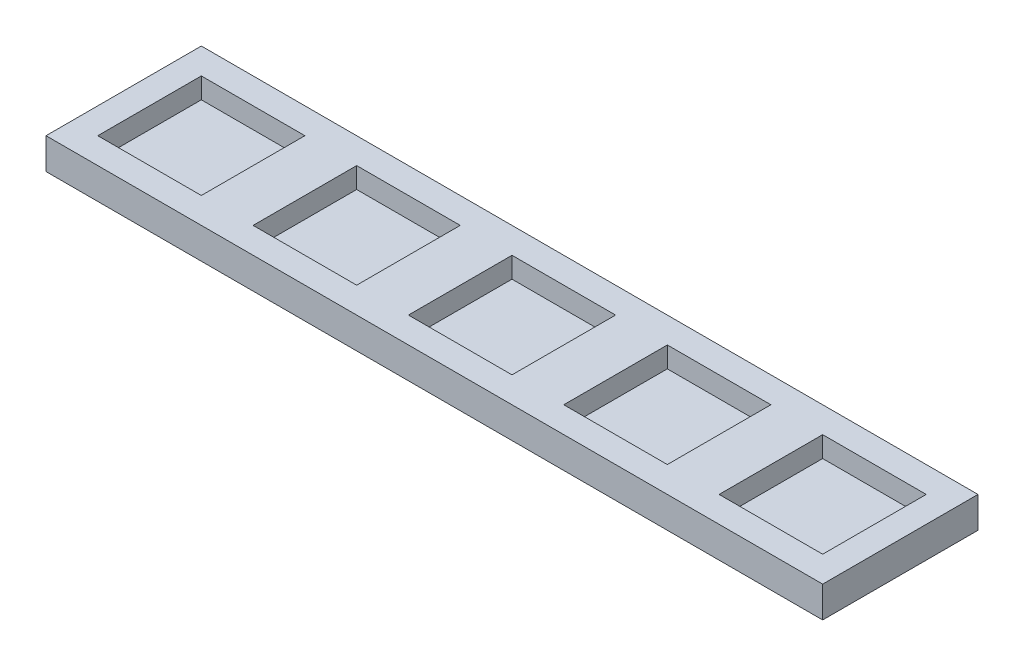
ISO-10303-21;
HEADER;
FILE_DESCRIPTION(('STEP AP214'),'2;1');
FILE_NAME('part.step','',(''),(''),'','','');
FILE_SCHEMA(('AUTOMOTIVE_DESIGN { 1 0 10303 214 1 1 1 1 }'));
ENDSEC;
DATA;
#1=APPLICATION_CONTEXT('core data for automotive mechanical design processes');
#2=APPLICATION_PROTOCOL_DEFINITION('international standard','automotive_design',2000,#1);
#3=PRODUCT_CONTEXT('',#1,'mechanical');
#4=PRODUCT('Part','Part','',(#3));
#5=PRODUCT_RELATED_PRODUCT_CATEGORY('part','',(#4));
#6=PRODUCT_DEFINITION_FORMATION('','',#4);
#7=PRODUCT_DEFINITION_CONTEXT('part definition',#1,'design');
#8=PRODUCT_DEFINITION('design','',#6,#7);
#9=PRODUCT_DEFINITION_SHAPE('','',#8);
#10=(LENGTH_UNIT() NAMED_UNIT(*) SI_UNIT(.MILLI.,.METRE.));
#11=(NAMED_UNIT(*) PLANE_ANGLE_UNIT() SI_UNIT($,.RADIAN.));
#12=(NAMED_UNIT(*) SI_UNIT($,.STERADIAN.) SOLID_ANGLE_UNIT());
#13=UNCERTAINTY_MEASURE_WITH_UNIT(LENGTH_MEASURE(1.E-05),#10,'distance_accuracy_value','');
#14=(GEOMETRIC_REPRESENTATION_CONTEXT(3) GLOBAL_UNCERTAINTY_ASSIGNED_CONTEXT((#13)) GLOBAL_UNIT_ASSIGNED_CONTEXT((#10,
#11,#12)) REPRESENTATION_CONTEXT('',''));
#15=CARTESIAN_POINT('',(0.,0.,0.));
#16=DIRECTION('',(0.,0.,1.));
#17=DIRECTION('',(1.,0.,0.));
#18=AXIS2_PLACEMENT_3D('',#15,#16,#17);
#19=CARTESIAN_POINT('',(-375.,30.,150.));
#20=DIRECTION('',(0.,0.,-1.));
#21=DIRECTION('',(-1.,0.,0.));
#22=AXIS2_PLACEMENT_3D('',#19,#20,#21);
#23=PLANE('',#22);
#24=DIRECTION('',(1.,0.,0.));
#25=VECTOR('',#24,1.);
#26=CARTESIAN_POINT('',(-375.,0.,150.));
#27=LINE('',#26,#25);
#28=CARTESIAN_POINT('',(-375.,0.,150.));
#29=VERTEX_POINT('',#28);
#30=CARTESIAN_POINT('',(375.,0.,150.));
#31=VERTEX_POINT('',#30);
#32=EDGE_CURVE('E232',#29,#31,#27,.T.);
#33=ORIENTED_EDGE('',*,*,#32,.T.);
#34=DIRECTION('',(0.,-1.,0.));
#35=VECTOR('',#34,1.);
#36=CARTESIAN_POINT('',(375.,30.,150.));
#37=LINE('',#36,#35);
#38=CARTESIAN_POINT('',(375.,30.,150.));
#39=VERTEX_POINT('',#38);
#40=EDGE_CURVE('E11',#39,#31,#37,.T.);
#41=ORIENTED_EDGE('',*,*,#40,.F.);
#42=DIRECTION('',(1.,0.,0.));
#43=VECTOR('',#42,1.);
#44=CARTESIAN_POINT('',(-375.,30.,150.));
#45=LINE('',#44,#43);
#46=CARTESIAN_POINT('',(-375.,30.,150.));
#47=VERTEX_POINT('',#46);
#48=EDGE_CURVE('E361',#47,#39,#45,.T.);
#49=ORIENTED_EDGE('',*,*,#48,.F.);
#50=DIRECTION('',(0.,-1.,0.));
#51=VECTOR('',#50,1.);
#52=CARTESIAN_POINT('',(-375.,30.,150.));
#53=LINE('',#52,#51);
#54=EDGE_CURVE('E371',#47,#29,#53,.T.);
#55=ORIENTED_EDGE('',*,*,#54,.T.);
#56=EDGE_LOOP('',(#33,#41,#49,#55));
#57=FACE_BOUND('',#56,.T.);
#58=ADVANCED_FACE('F36',(#57),#23,.F.);
#59=CARTESIAN_POINT('',(375.,30.,150.));
#60=DIRECTION('',(-1.,0.,0.));
#61=DIRECTION('',(0.,0.,1.));
#62=AXIS2_PLACEMENT_3D('',#59,#60,#61);
#63=PLANE('',#62);
#64=DIRECTION('',(0.,0.,-1.));
#65=VECTOR('',#64,1.);
#66=CARTESIAN_POINT('',(375.,0.,150.));
#67=LINE('',#66,#65);
#68=CARTESIAN_POINT('',(375.,0.,-1.22464679914735E-13));
#69=VERTEX_POINT('',#68);
#70=EDGE_CURVE('E374',#31,#69,#67,.T.);
#71=ORIENTED_EDGE('',*,*,#70,.T.);
#72=DIRECTION('',(0.,-1.,0.));
#73=VECTOR('',#72,1.);
#74=CARTESIAN_POINT('',(375.,30.,-1.22464679914735E-13));
#75=LINE('',#74,#73);
#76=CARTESIAN_POINT('',(375.,30.,-1.22464679914735E-13));
#77=VERTEX_POINT('',#76);
#78=EDGE_CURVE('E43',#77,#69,#75,.T.);
#79=ORIENTED_EDGE('',*,*,#78,.F.);
#80=DIRECTION('',(0.,0.,-1.));
#81=VECTOR('',#80,1.);
#82=CARTESIAN_POINT('',(375.,30.,150.));
#83=LINE('',#82,#81);
#84=EDGE_CURVE('E364',#39,#77,#83,.T.);
#85=ORIENTED_EDGE('',*,*,#84,.F.);
#86=ORIENTED_EDGE('',*,*,#40,.T.);
#87=EDGE_LOOP('',(#71,#79,#85,#86));
#88=FACE_BOUND('',#87,.T.);
#89=ADVANCED_FACE('F404',(#88),#63,.F.);
#90=CARTESIAN_POINT('',(375.,30.,-1.22464679914735E-13));
#91=DIRECTION('',(0.,0.,1.));
#92=DIRECTION('',(1.,0.,0.));
#93=AXIS2_PLACEMENT_3D('',#90,#91,#92);
#94=PLANE('',#93);
#95=DIRECTION('',(-1.,0.,0.));
#96=VECTOR('',#95,1.);
#97=CARTESIAN_POINT('',(375.,0.,-1.22464679914735E-13));
#98=LINE('',#97,#96);
#99=CARTESIAN_POINT('',(-375.,0.,1.07156594925393E-13));
#100=VERTEX_POINT('',#99);
#101=EDGE_CURVE('E376',#69,#100,#98,.T.);
#102=ORIENTED_EDGE('',*,*,#101,.T.);
#103=DIRECTION('',(0.,-1.,0.));
#104=VECTOR('',#103,1.);
#105=CARTESIAN_POINT('',(-375.,30.,1.07156594925393E-13));
#106=LINE('',#105,#104);
#107=CARTESIAN_POINT('',(-375.,30.,1.07156594925393E-13));
#108=VERTEX_POINT('',#107);
#109=EDGE_CURVE('E381',#108,#100,#106,.T.);
#110=ORIENTED_EDGE('',*,*,#109,.F.);
#111=DIRECTION('',(-1.,0.,0.));
#112=VECTOR('',#111,1.);
#113=CARTESIAN_POINT('',(375.,30.,-1.22464679914735E-13));
#114=LINE('',#113,#112);
#115=EDGE_CURVE('E367',#77,#108,#114,.T.);
#116=ORIENTED_EDGE('',*,*,#115,.F.);
#117=ORIENTED_EDGE('',*,*,#78,.T.);
#118=EDGE_LOOP('',(#102,#110,#116,#117));
#119=FACE_BOUND('',#118,.T.);
#120=ADVANCED_FACE('F388',(#119),#94,.F.);
#121=CARTESIAN_POINT('',(-375.,30.,1.07156594925393E-13));
#122=DIRECTION('',(1.,0.,0.));
#123=DIRECTION('',(0.,0.,-1.));
#124=AXIS2_PLACEMENT_3D('',#121,#122,#123);
#125=PLANE('',#124);
#126=DIRECTION('',(0.,0.,1.));
#127=VECTOR('',#126,1.);
#128=CARTESIAN_POINT('',(-375.,0.,1.07156594925393E-13));
#129=LINE('',#128,#127);
#130=EDGE_CURVE('E365',#100,#29,#129,.T.);
#131=ORIENTED_EDGE('',*,*,#130,.T.);
#132=ORIENTED_EDGE('',*,*,#54,.F.);
#133=DIRECTION('',(0.,0.,1.));
#134=VECTOR('',#133,1.);
#135=CARTESIAN_POINT('',(-375.,30.,1.07156594925393E-13));
#136=LINE('',#135,#134);
#137=EDGE_CURVE('E369',#108,#47,#136,.T.);
#138=ORIENTED_EDGE('',*,*,#137,.F.);
#139=ORIENTED_EDGE('',*,*,#109,.T.);
#140=EDGE_LOOP('',(#131,#132,#138,#139));
#141=FACE_BOUND('',#140,.T.);
#142=ADVANCED_FACE('F397',(#141),#125,.F.);
#143=CARTESIAN_POINT('',(0.,30.,0.));
#144=DIRECTION('',(0.,1.,0.));
#145=DIRECTION('',(0.,0.,1.));
#146=AXIS2_PLACEMENT_3D('',#143,#144,#145);
#147=PLANE('',#146);
#148=DIRECTION('',(0.,0.,-1.));
#149=VECTOR('',#148,1.);
#150=CARTESIAN_POINT('',(-250.,30.,25.0000000000001));
#151=LINE('',#150,#149);
#152=CARTESIAN_POINT('',(-250.,30.,125.));
#153=VERTEX_POINT('',#152);
#154=CARTESIAN_POINT('',(-250.,30.,25.0000000000001));
#155=VERTEX_POINT('',#154);
#156=EDGE_CURVE('E50',#153,#155,#151,.T.);
#157=ORIENTED_EDGE('',*,*,#156,.F.);
#158=DIRECTION('',(1.,0.,0.));
#159=VECTOR('',#158,1.);
#160=CARTESIAN_POINT('',(-350.,30.,125.));
#161=LINE('',#160,#159);
#162=CARTESIAN_POINT('',(-350.,30.,125.));
#163=VERTEX_POINT('',#162);
#164=EDGE_CURVE('E216',#163,#153,#161,.T.);
#165=ORIENTED_EDGE('',*,*,#164,.F.);
#166=DIRECTION('',(0.,0.,1.));
#167=VECTOR('',#166,1.);
#168=CARTESIAN_POINT('',(-350.,30.,25.0000000000002));
#169=LINE('',#168,#167);
#170=CARTESIAN_POINT('',(-350.,30.,25.0000000000002));
#171=VERTEX_POINT('',#170);
#172=EDGE_CURVE('E219',#171,#163,#169,.T.);
#173=ORIENTED_EDGE('',*,*,#172,.F.);
#174=DIRECTION('',(-1.,0.,0.));
#175=VECTOR('',#174,1.);
#176=CARTESIAN_POINT('',(-350.,30.,25.0000000000002));
#177=LINE('',#176,#175);
#178=EDGE_CURVE('E225',#155,#171,#177,.T.);
#179=ORIENTED_EDGE('',*,*,#178,.F.);
#180=EDGE_LOOP('',(#157,#165,#173,#179));
#181=FACE_BOUND('',#180,.T.);
#182=DIRECTION('',(0.,0.,-1.));
#183=VECTOR('',#182,1.);
#184=CARTESIAN_POINT('',(-99.9999999999999,30.,25.0000000000001));
#185=LINE('',#184,#183);
#186=CARTESIAN_POINT('',(-99.9999999999997,30.,125.));
#187=VERTEX_POINT('',#186);
#188=CARTESIAN_POINT('',(-99.9999999999999,30.,25.0000000000001));
#189=VERTEX_POINT('',#188);
#190=EDGE_CURVE('E58',#187,#189,#185,.T.);
#191=ORIENTED_EDGE('',*,*,#190,.F.);
#192=DIRECTION('',(1.,0.,0.));
#193=VECTOR('',#192,1.);
#194=CARTESIAN_POINT('',(-200.,30.,125.));
#195=LINE('',#194,#193);
#196=CARTESIAN_POINT('',(-200.,30.,125.));
#197=VERTEX_POINT('',#196);
#198=EDGE_CURVE('E240',#197,#187,#195,.T.);
#199=ORIENTED_EDGE('',*,*,#198,.F.);
#200=DIRECTION('',(0.,0.,1.));
#201=VECTOR('',#200,1.);
#202=CARTESIAN_POINT('',(-200.,30.,25.0000000000002));
#203=LINE('',#202,#201);
#204=CARTESIAN_POINT('',(-200.,30.,25.0000000000002));
#205=VERTEX_POINT('',#204);
#206=EDGE_CURVE('E255',#205,#197,#203,.T.);
#207=ORIENTED_EDGE('',*,*,#206,.F.);
#208=DIRECTION('',(-1.,0.,0.));
#209=VECTOR('',#208,1.);
#210=CARTESIAN_POINT('',(-200.,30.,25.0000000000002));
#211=LINE('',#210,#209);
#212=EDGE_CURVE('E251',#189,#205,#211,.T.);
#213=ORIENTED_EDGE('',*,*,#212,.F.);
#214=EDGE_LOOP('',(#191,#199,#207,#213));
#215=FACE_BOUND('',#214,.T.);
#216=DIRECTION('',(0.,0.,-1.));
#217=VECTOR('',#216,1.);
#218=CARTESIAN_POINT('',(50.0000000000001,30.,25.0000000000001));
#219=LINE('',#218,#217);
#220=CARTESIAN_POINT('',(50.0000000000003,30.,125.));
#221=VERTEX_POINT('',#220);
#222=CARTESIAN_POINT('',(50.0000000000001,30.,25.0000000000001));
#223=VERTEX_POINT('',#222);
#224=EDGE_CURVE('E280',#221,#223,#219,.T.);
#225=ORIENTED_EDGE('',*,*,#224,.F.);
#226=DIRECTION('',(1.,0.,0.));
#227=VECTOR('',#226,1.);
#228=CARTESIAN_POINT('',(-49.9999999999997,30.,125.));
#229=LINE('',#228,#227);
#230=CARTESIAN_POINT('',(-49.9999999999997,30.,125.));
#231=VERTEX_POINT('',#230);
#232=EDGE_CURVE('E270',#231,#221,#229,.T.);
#233=ORIENTED_EDGE('',*,*,#232,.F.);
#234=DIRECTION('',(0.,0.,1.));
#235=VECTOR('',#234,1.);
#236=CARTESIAN_POINT('',(-49.9999999999999,30.,25.0000000000002));
#237=LINE('',#236,#235);
#238=CARTESIAN_POINT('',(-49.9999999999999,30.,25.0000000000002));
#239=VERTEX_POINT('',#238);
#240=EDGE_CURVE('E286',#239,#231,#237,.T.);
#241=ORIENTED_EDGE('',*,*,#240,.F.);
#242=DIRECTION('',(-1.,0.,0.));
#243=VECTOR('',#242,1.);
#244=CARTESIAN_POINT('',(-49.9999999999999,30.,25.0000000000002));
#245=LINE('',#244,#243);
#246=EDGE_CURVE('E282',#223,#239,#245,.T.);
#247=ORIENTED_EDGE('',*,*,#246,.F.);
#248=EDGE_LOOP('',(#225,#233,#241,#247));
#249=FACE_BOUND('',#248,.T.);
#250=DIRECTION('',(0.,0.,-1.));
#251=VECTOR('',#250,1.);
#252=CARTESIAN_POINT('',(200.,30.,25.0000000000001));
#253=LINE('',#252,#251);
#254=CARTESIAN_POINT('',(200.,30.,125.));
#255=VERTEX_POINT('',#254);
#256=CARTESIAN_POINT('',(200.,30.,25.0000000000001));
#257=VERTEX_POINT('',#256);
#258=EDGE_CURVE('E312',#255,#257,#253,.T.);
#259=ORIENTED_EDGE('',*,*,#258,.F.);
#260=DIRECTION('',(1.,0.,0.));
#261=VECTOR('',#260,1.);
#262=CARTESIAN_POINT('',(100.,30.,125.));
#263=LINE('',#262,#261);
#264=CARTESIAN_POINT('',(100.,30.,125.));
#265=VERTEX_POINT('',#264);
#266=EDGE_CURVE('E302',#265,#255,#263,.T.);
#267=ORIENTED_EDGE('',*,*,#266,.F.);
#268=DIRECTION('',(0.,0.,1.));
#269=VECTOR('',#268,1.);
#270=CARTESIAN_POINT('',(100.,30.,25.0000000000002));
#271=LINE('',#270,#269);
#272=CARTESIAN_POINT('',(100.,30.,25.0000000000002));
#273=VERTEX_POINT('',#272);
#274=EDGE_CURVE('E318',#273,#265,#271,.T.);
#275=ORIENTED_EDGE('',*,*,#274,.F.);
#276=DIRECTION('',(-1.,0.,0.));
#277=VECTOR('',#276,1.);
#278=CARTESIAN_POINT('',(100.,30.,25.0000000000002));
#279=LINE('',#278,#277);
#280=EDGE_CURVE('E314',#257,#273,#279,.T.);
#281=ORIENTED_EDGE('',*,*,#280,.F.);
#282=EDGE_LOOP('',(#259,#267,#275,#281));
#283=FACE_BOUND('',#282,.T.);
#284=DIRECTION('',(0.,0.,-1.));
#285=VECTOR('',#284,1.);
#286=CARTESIAN_POINT('',(350.,30.,25.0000000000001));
#287=LINE('',#286,#285);
#288=CARTESIAN_POINT('',(350.,30.,125.));
#289=VERTEX_POINT('',#288);
#290=CARTESIAN_POINT('',(350.,30.,25.0000000000001));
#291=VERTEX_POINT('',#290);
#292=EDGE_CURVE('E344',#289,#291,#287,.T.);
#293=ORIENTED_EDGE('',*,*,#292,.F.);
#294=DIRECTION('',(1.,0.,0.));
#295=VECTOR('',#294,1.);
#296=CARTESIAN_POINT('',(250.,30.,125.));
#297=LINE('',#296,#295);
#298=CARTESIAN_POINT('',(250.,30.,125.));
#299=VERTEX_POINT('',#298);
#300=EDGE_CURVE('E334',#299,#289,#297,.T.);
#301=ORIENTED_EDGE('',*,*,#300,.F.);
#302=DIRECTION('',(0.,0.,1.));
#303=VECTOR('',#302,1.);
#304=CARTESIAN_POINT('',(250.,30.,25.0000000000002));
#305=LINE('',#304,#303);
#306=CARTESIAN_POINT('',(250.,30.,25.0000000000002));
#307=VERTEX_POINT('',#306);
#308=EDGE_CURVE('E349',#307,#299,#305,.T.);
#309=ORIENTED_EDGE('',*,*,#308,.F.);
#310=DIRECTION('',(-1.,0.,0.));
#311=VECTOR('',#310,1.);
#312=CARTESIAN_POINT('',(250.,30.,25.0000000000002));
#313=LINE('',#312,#311);
#314=EDGE_CURVE('E346',#291,#307,#313,.T.);
#315=ORIENTED_EDGE('',*,*,#314,.F.);
#316=EDGE_LOOP('',(#293,#301,#309,#315));
#317=FACE_BOUND('',#316,.T.);
#318=ORIENTED_EDGE('',*,*,#48,.T.);
#319=ORIENTED_EDGE('',*,*,#84,.T.);
#320=ORIENTED_EDGE('',*,*,#115,.T.);
#321=ORIENTED_EDGE('',*,*,#137,.T.);
#322=EDGE_LOOP('',(#318,#319,#320,#321));
#323=FACE_BOUND('',#322,.T.);
#324=ADVANCED_FACE('F403',(#181,#215,#249,#283,#317,#323),#147,.T.);
#325=CARTESIAN_POINT('',(0.,0.,0.));
#326=DIRECTION('',(0.,1.,0.));
#327=DIRECTION('',(0.,0.,1.));
#328=AXIS2_PLACEMENT_3D('',#325,#326,#327);
#329=PLANE('',#328);
#330=ORIENTED_EDGE('',*,*,#32,.F.);
#331=ORIENTED_EDGE('',*,*,#130,.F.);
#332=ORIENTED_EDGE('',*,*,#101,.F.);
#333=ORIENTED_EDGE('',*,*,#70,.F.);
#334=EDGE_LOOP('',(#330,#331,#332,#333));
#335=FACE_BOUND('',#334,.T.);
#336=ADVANCED_FACE('F394',(#335),#329,.F.);
#337=CARTESIAN_POINT('',(350.,10.,25.0000000000001));
#338=DIRECTION('',(1.,0.,0.));
#339=DIRECTION('',(0.,0.,-1.));
#340=AXIS2_PLACEMENT_3D('',#337,#338,#339);
#341=PLANE('',#340);
#342=ORIENTED_EDGE('',*,*,#292,.T.);
#343=DIRECTION('',(0.,1.,0.));
#344=VECTOR('',#343,1.);
#345=CARTESIAN_POINT('',(350.,10.,25.0000000000001));
#346=LINE('',#345,#344);
#347=CARTESIAN_POINT('',(350.,10.,25.0000000000001));
#348=VERTEX_POINT('',#347);
#349=EDGE_CURVE('E343',#348,#291,#346,.T.);
#350=ORIENTED_EDGE('',*,*,#349,.F.);
#351=DIRECTION('',(0.,0.,-1.));
#352=VECTOR('',#351,1.);
#353=CARTESIAN_POINT('',(350.,10.,25.0000000000001));
#354=LINE('',#353,#352);
#355=CARTESIAN_POINT('',(350.,10.,125.));
#356=VERTEX_POINT('',#355);
#357=EDGE_CURVE('E330',#356,#348,#354,.T.);
#358=ORIENTED_EDGE('',*,*,#357,.F.);
#359=DIRECTION('',(0.,1.,0.));
#360=VECTOR('',#359,1.);
#361=CARTESIAN_POINT('',(350.,10.,125.));
#362=LINE('',#361,#360);
#363=EDGE_CURVE('E315',#356,#289,#362,.T.);
#364=ORIENTED_EDGE('',*,*,#363,.T.);
#365=EDGE_LOOP('',(#342,#350,#358,#364));
#366=FACE_BOUND('',#365,.T.);
#367=ADVANCED_FACE('F416',(#366),#341,.F.);
#368=CARTESIAN_POINT('',(250.,10.,125.));
#369=DIRECTION('',(0.,0.,1.));
#370=DIRECTION('',(1.,0.,0.));
#371=AXIS2_PLACEMENT_3D('',#368,#369,#370);
#372=PLANE('',#371);
#373=ORIENTED_EDGE('',*,*,#300,.T.);
#374=ORIENTED_EDGE('',*,*,#363,.F.);
#375=DIRECTION('',(1.,0.,0.));
#376=VECTOR('',#375,1.);
#377=CARTESIAN_POINT('',(250.,10.,125.));
#378=LINE('',#377,#376);
#379=CARTESIAN_POINT('',(250.,10.,125.));
#380=VERTEX_POINT('',#379);
#381=EDGE_CURVE('E340',#380,#356,#378,.T.);
#382=ORIENTED_EDGE('',*,*,#381,.F.);
#383=DIRECTION('',(0.,1.,0.));
#384=VECTOR('',#383,1.);
#385=CARTESIAN_POINT('',(250.,10.,125.));
#386=LINE('',#385,#384);
#387=EDGE_CURVE('E355',#380,#299,#386,.T.);
#388=ORIENTED_EDGE('',*,*,#387,.T.);
#389=EDGE_LOOP('',(#373,#374,#382,#388));
#390=FACE_BOUND('',#389,.T.);
#391=ADVANCED_FACE('F422',(#390),#372,.F.);
#392=CARTESIAN_POINT('',(250.,10.,25.0000000000002));
#393=DIRECTION('',(-1.,0.,0.));
#394=DIRECTION('',(0.,0.,1.));
#395=AXIS2_PLACEMENT_3D('',#392,#393,#394);
#396=PLANE('',#395);
#397=ORIENTED_EDGE('',*,*,#308,.T.);
#398=ORIENTED_EDGE('',*,*,#387,.F.);
#399=DIRECTION('',(0.,0.,1.));
#400=VECTOR('',#399,1.);
#401=CARTESIAN_POINT('',(250.,10.,25.0000000000002));
#402=LINE('',#401,#400);
#403=CARTESIAN_POINT('',(250.,10.,25.0000000000002));
#404=VERTEX_POINT('',#403);
#405=EDGE_CURVE('E337',#404,#380,#402,.T.);
#406=ORIENTED_EDGE('',*,*,#405,.F.);
#407=DIRECTION('',(0.,1.,0.));
#408=VECTOR('',#407,1.);
#409=CARTESIAN_POINT('',(250.,10.,25.0000000000002));
#410=LINE('',#409,#408);
#411=EDGE_CURVE('E357',#404,#307,#410,.T.);
#412=ORIENTED_EDGE('',*,*,#411,.T.);
#413=EDGE_LOOP('',(#397,#398,#406,#412));
#414=FACE_BOUND('',#413,.T.);
#415=ADVANCED_FACE('F428',(#414),#396,.F.);
#416=CARTESIAN_POINT('',(250.,10.,25.0000000000002));
#417=DIRECTION('',(0.,0.,-1.));
#418=DIRECTION('',(-1.,0.,0.));
#419=AXIS2_PLACEMENT_3D('',#416,#417,#418);
#420=PLANE('',#419);
#421=ORIENTED_EDGE('',*,*,#314,.T.);
#422=ORIENTED_EDGE('',*,*,#411,.F.);
#423=DIRECTION('',(-1.,0.,0.));
#424=VECTOR('',#423,1.);
#425=CARTESIAN_POINT('',(250.,10.,25.0000000000002));
#426=LINE('',#425,#424);
#427=EDGE_CURVE('E333',#348,#404,#426,.T.);
#428=ORIENTED_EDGE('',*,*,#427,.F.);
#429=ORIENTED_EDGE('',*,*,#349,.T.);
#430=EDGE_LOOP('',(#421,#422,#428,#429));
#431=FACE_BOUND('',#430,.T.);
#432=ADVANCED_FACE('F424',(#431),#420,.F.);
#433=CARTESIAN_POINT('',(0.,10.,0.));
#434=DIRECTION('',(0.,1.,0.));
#435=DIRECTION('',(0.,0.,1.));
#436=AXIS2_PLACEMENT_3D('',#433,#434,#435);
#437=PLANE('',#436);
#438=ORIENTED_EDGE('',*,*,#357,.T.);
#439=ORIENTED_EDGE('',*,*,#427,.T.);
#440=ORIENTED_EDGE('',*,*,#405,.T.);
#441=ORIENTED_EDGE('',*,*,#381,.T.);
#442=EDGE_LOOP('',(#438,#439,#440,#441));
#443=FACE_BOUND('',#442,.T.);
#444=ADVANCED_FACE('F427',(#443),#437,.T.);
#445=CARTESIAN_POINT('',(200.,10.,25.0000000000001));
#446=DIRECTION('',(1.,0.,0.));
#447=DIRECTION('',(0.,0.,-1.));
#448=AXIS2_PLACEMENT_3D('',#445,#446,#447);
#449=PLANE('',#448);
#450=ORIENTED_EDGE('',*,*,#258,.T.);
#451=DIRECTION('',(0.,1.,0.));
#452=VECTOR('',#451,1.);
#453=CARTESIAN_POINT('',(200.,10.,25.0000000000001));
#454=LINE('',#453,#452);
#455=CARTESIAN_POINT('',(200.,10.,25.0000000000001));
#456=VERTEX_POINT('',#455);
#457=EDGE_CURVE('E311',#456,#257,#454,.T.);
#458=ORIENTED_EDGE('',*,*,#457,.F.);
#459=DIRECTION('',(0.,0.,-1.));
#460=VECTOR('',#459,1.);
#461=CARTESIAN_POINT('',(200.,10.,25.0000000000001));
#462=LINE('',#461,#460);
#463=CARTESIAN_POINT('',(200.,10.,125.));
#464=VERTEX_POINT('',#463);
#465=EDGE_CURVE('E298',#464,#456,#462,.T.);
#466=ORIENTED_EDGE('',*,*,#465,.F.);
#467=DIRECTION('',(0.,1.,0.));
#468=VECTOR('',#467,1.);
#469=CARTESIAN_POINT('',(200.,10.,125.));
#470=LINE('',#469,#468);
#471=EDGE_CURVE('E283',#464,#255,#470,.T.);
#472=ORIENTED_EDGE('',*,*,#471,.T.);
#473=EDGE_LOOP('',(#450,#458,#466,#472));
#474=FACE_BOUND('',#473,.T.);
#475=ADVANCED_FACE('F438',(#474),#449,.F.);
#476=CARTESIAN_POINT('',(100.,10.,125.));
#477=DIRECTION('',(0.,0.,1.));
#478=DIRECTION('',(1.,0.,0.));
#479=AXIS2_PLACEMENT_3D('',#476,#477,#478);
#480=PLANE('',#479);
#481=ORIENTED_EDGE('',*,*,#266,.T.);
#482=ORIENTED_EDGE('',*,*,#471,.F.);
#483=DIRECTION('',(1.,0.,0.));
#484=VECTOR('',#483,1.);
#485=CARTESIAN_POINT('',(100.,10.,125.));
#486=LINE('',#485,#484);
#487=CARTESIAN_POINT('',(100.,10.,125.));
#488=VERTEX_POINT('',#487);
#489=EDGE_CURVE('E308',#488,#464,#486,.T.);
#490=ORIENTED_EDGE('',*,*,#489,.F.);
#491=DIRECTION('',(0.,1.,0.));
#492=VECTOR('',#491,1.);
#493=CARTESIAN_POINT('',(100.,10.,125.));
#494=LINE('',#493,#492);
#495=EDGE_CURVE('E324',#488,#265,#494,.T.);
#496=ORIENTED_EDGE('',*,*,#495,.T.);
#497=EDGE_LOOP('',(#481,#482,#490,#496));
#498=FACE_BOUND('',#497,.T.);
#499=ADVANCED_FACE('F442',(#498),#480,.F.);
#500=CARTESIAN_POINT('',(100.,10.,25.0000000000002));
#501=DIRECTION('',(-1.,0.,0.));
#502=DIRECTION('',(0.,0.,1.));
#503=AXIS2_PLACEMENT_3D('',#500,#501,#502);
#504=PLANE('',#503);
#505=ORIENTED_EDGE('',*,*,#274,.T.);
#506=ORIENTED_EDGE('',*,*,#495,.F.);
#507=DIRECTION('',(0.,0.,1.));
#508=VECTOR('',#507,1.);
#509=CARTESIAN_POINT('',(100.,10.,25.0000000000002));
#510=LINE('',#509,#508);
#511=CARTESIAN_POINT('',(100.,10.,25.0000000000002));
#512=VERTEX_POINT('',#511);
#513=EDGE_CURVE('E305',#512,#488,#510,.T.);
#514=ORIENTED_EDGE('',*,*,#513,.F.);
#515=DIRECTION('',(0.,1.,0.));
#516=VECTOR('',#515,1.);
#517=CARTESIAN_POINT('',(100.,10.,25.0000000000002));
#518=LINE('',#517,#516);
#519=EDGE_CURVE('E326',#512,#273,#518,.T.);
#520=ORIENTED_EDGE('',*,*,#519,.T.);
#521=EDGE_LOOP('',(#505,#506,#514,#520));
#522=FACE_BOUND('',#521,.T.);
#523=ADVANCED_FACE('F448',(#522),#504,.F.);
#524=CARTESIAN_POINT('',(100.,10.,25.0000000000002));
#525=DIRECTION('',(0.,0.,-1.));
#526=DIRECTION('',(-1.,0.,0.));
#527=AXIS2_PLACEMENT_3D('',#524,#525,#526);
#528=PLANE('',#527);
#529=ORIENTED_EDGE('',*,*,#280,.T.);
#530=ORIENTED_EDGE('',*,*,#519,.F.);
#531=DIRECTION('',(-1.,0.,0.));
#532=VECTOR('',#531,1.);
#533=CARTESIAN_POINT('',(100.,10.,25.0000000000002));
#534=LINE('',#533,#532);
#535=EDGE_CURVE('E301',#456,#512,#534,.T.);
#536=ORIENTED_EDGE('',*,*,#535,.F.);
#537=ORIENTED_EDGE('',*,*,#457,.T.);
#538=EDGE_LOOP('',(#529,#530,#536,#537));
#539=FACE_BOUND('',#538,.T.);
#540=ADVANCED_FACE('F444',(#539),#528,.F.);
#541=CARTESIAN_POINT('',(0.,10.,0.));
#542=DIRECTION('',(0.,1.,0.));
#543=DIRECTION('',(0.,0.,1.));
#544=AXIS2_PLACEMENT_3D('',#541,#542,#543);
#545=PLANE('',#544);
#546=ORIENTED_EDGE('',*,*,#465,.T.);
#547=ORIENTED_EDGE('',*,*,#535,.T.);
#548=ORIENTED_EDGE('',*,*,#513,.T.);
#549=ORIENTED_EDGE('',*,*,#489,.T.);
#550=EDGE_LOOP('',(#546,#547,#548,#549));
#551=FACE_BOUND('',#550,.T.);
#552=ADVANCED_FACE('F447',(#551),#545,.T.);
#553=CARTESIAN_POINT('',(50.0000000000001,10.,25.0000000000001));
#554=DIRECTION('',(1.,0.,0.));
#555=DIRECTION('',(0.,0.,-1.));
#556=AXIS2_PLACEMENT_3D('',#553,#554,#555);
#557=PLANE('',#556);
#558=ORIENTED_EDGE('',*,*,#224,.T.);
#559=DIRECTION('',(0.,1.,0.));
#560=VECTOR('',#559,1.);
#561=CARTESIAN_POINT('',(50.0000000000001,10.,25.0000000000001));
#562=LINE('',#561,#560);
#563=CARTESIAN_POINT('',(50.0000000000001,10.,25.0000000000001));
#564=VERTEX_POINT('',#563);
#565=EDGE_CURVE('E279',#564,#223,#562,.T.);
#566=ORIENTED_EDGE('',*,*,#565,.F.);
#567=DIRECTION('',(0.,0.,-1.));
#568=VECTOR('',#567,1.);
#569=CARTESIAN_POINT('',(50.0000000000001,10.,25.0000000000001));
#570=LINE('',#569,#568);
#571=CARTESIAN_POINT('',(50.0000000000003,10.,125.));
#572=VERTEX_POINT('',#571);
#573=EDGE_CURVE('E266',#572,#564,#570,.T.);
#574=ORIENTED_EDGE('',*,*,#573,.F.);
#575=DIRECTION('',(0.,1.,0.));
#576=VECTOR('',#575,1.);
#577=CARTESIAN_POINT('',(50.0000000000003,10.,125.));
#578=LINE('',#577,#576);
#579=EDGE_CURVE('E252',#572,#221,#578,.T.);
#580=ORIENTED_EDGE('',*,*,#579,.T.);
#581=EDGE_LOOP('',(#558,#566,#574,#580));
#582=FACE_BOUND('',#581,.T.);
#583=ADVANCED_FACE('F458',(#582),#557,.F.);
#584=CARTESIAN_POINT('',(-49.9999999999997,10.,125.));
#585=DIRECTION('',(0.,0.,1.));
#586=DIRECTION('',(1.,0.,0.));
#587=AXIS2_PLACEMENT_3D('',#584,#585,#586);
#588=PLANE('',#587);
#589=ORIENTED_EDGE('',*,*,#232,.T.);
#590=ORIENTED_EDGE('',*,*,#579,.F.);
#591=DIRECTION('',(1.,0.,0.));
#592=VECTOR('',#591,1.);
#593=CARTESIAN_POINT('',(-49.9999999999997,10.,125.));
#594=LINE('',#593,#592);
#595=CARTESIAN_POINT('',(-49.9999999999997,10.,125.));
#596=VERTEX_POINT('',#595);
#597=EDGE_CURVE('E276',#596,#572,#594,.T.);
#598=ORIENTED_EDGE('',*,*,#597,.F.);
#599=DIRECTION('',(0.,1.,0.));
#600=VECTOR('',#599,1.);
#601=CARTESIAN_POINT('',(-49.9999999999997,10.,125.));
#602=LINE('',#601,#600);
#603=EDGE_CURVE('E292',#596,#231,#602,.T.);
#604=ORIENTED_EDGE('',*,*,#603,.T.);
#605=EDGE_LOOP('',(#589,#590,#598,#604));
#606=FACE_BOUND('',#605,.T.);
#607=ADVANCED_FACE('F462',(#606),#588,.F.);
#608=CARTESIAN_POINT('',(-49.9999999999999,10.,25.0000000000002));
#609=DIRECTION('',(-1.,0.,0.));
#610=DIRECTION('',(0.,0.,1.));
#611=AXIS2_PLACEMENT_3D('',#608,#609,#610);
#612=PLANE('',#611);
#613=ORIENTED_EDGE('',*,*,#240,.T.);
#614=ORIENTED_EDGE('',*,*,#603,.F.);
#615=DIRECTION('',(0.,0.,1.));
#616=VECTOR('',#615,1.);
#617=CARTESIAN_POINT('',(-49.9999999999999,10.,25.0000000000002));
#618=LINE('',#617,#616);
#619=CARTESIAN_POINT('',(-49.9999999999999,10.,25.0000000000002));
#620=VERTEX_POINT('',#619);
#621=EDGE_CURVE('E273',#620,#596,#618,.T.);
#622=ORIENTED_EDGE('',*,*,#621,.F.);
#623=DIRECTION('',(0.,1.,0.));
#624=VECTOR('',#623,1.);
#625=CARTESIAN_POINT('',(-49.9999999999999,10.,25.0000000000002));
#626=LINE('',#625,#624);
#627=EDGE_CURVE('E294',#620,#239,#626,.T.);
#628=ORIENTED_EDGE('',*,*,#627,.T.);
#629=EDGE_LOOP('',(#613,#614,#622,#628));
#630=FACE_BOUND('',#629,.T.);
#631=ADVANCED_FACE('F468',(#630),#612,.F.);
#632=CARTESIAN_POINT('',(-49.9999999999999,10.,25.0000000000002));
#633=DIRECTION('',(0.,0.,-1.));
#634=DIRECTION('',(-1.,0.,0.));
#635=AXIS2_PLACEMENT_3D('',#632,#633,#634);
#636=PLANE('',#635);
#637=ORIENTED_EDGE('',*,*,#246,.T.);
#638=ORIENTED_EDGE('',*,*,#627,.F.);
#639=DIRECTION('',(-1.,0.,0.));
#640=VECTOR('',#639,1.);
#641=CARTESIAN_POINT('',(-49.9999999999999,10.,25.0000000000002));
#642=LINE('',#641,#640);
#643=EDGE_CURVE('E269',#564,#620,#642,.T.);
#644=ORIENTED_EDGE('',*,*,#643,.F.);
#645=ORIENTED_EDGE('',*,*,#565,.T.);
#646=EDGE_LOOP('',(#637,#638,#644,#645));
#647=FACE_BOUND('',#646,.T.);
#648=ADVANCED_FACE('F464',(#647),#636,.F.);
#649=CARTESIAN_POINT('',(0.,10.,0.));
#650=DIRECTION('',(0.,1.,0.));
#651=DIRECTION('',(0.,0.,1.));
#652=AXIS2_PLACEMENT_3D('',#649,#650,#651);
#653=PLANE('',#652);
#654=ORIENTED_EDGE('',*,*,#573,.T.);
#655=ORIENTED_EDGE('',*,*,#643,.T.);
#656=ORIENTED_EDGE('',*,*,#621,.T.);
#657=ORIENTED_EDGE('',*,*,#597,.T.);
#658=EDGE_LOOP('',(#654,#655,#656,#657));
#659=FACE_BOUND('',#658,.T.);
#660=ADVANCED_FACE('F467',(#659),#653,.T.);
#661=CARTESIAN_POINT('',(-99.9999999999999,10.,25.0000000000001));
#662=DIRECTION('',(1.,0.,0.));
#663=DIRECTION('',(0.,0.,-1.));
#664=AXIS2_PLACEMENT_3D('',#661,#662,#663);
#665=PLANE('',#664);
#666=ORIENTED_EDGE('',*,*,#190,.T.);
#667=DIRECTION('',(0.,1.,0.));
#668=VECTOR('',#667,1.);
#669=CARTESIAN_POINT('',(-99.9999999999999,10.,25.0000000000001));
#670=LINE('',#669,#668);
#671=CARTESIAN_POINT('',(-99.9999999999999,10.,25.0000000000001));
#672=VERTEX_POINT('',#671);
#673=EDGE_CURVE('E249',#672,#189,#670,.T.);
#674=ORIENTED_EDGE('',*,*,#673,.F.);
#675=DIRECTION('',(0.,0.,-1.));
#676=VECTOR('',#675,1.);
#677=CARTESIAN_POINT('',(-99.9999999999999,10.,25.0000000000001));
#678=LINE('',#677,#676);
#679=CARTESIAN_POINT('',(-99.9999999999997,10.,125.));
#680=VERTEX_POINT('',#679);
#681=EDGE_CURVE('E236',#680,#672,#678,.T.);
#682=ORIENTED_EDGE('',*,*,#681,.F.);
#683=DIRECTION('',(0.,1.,0.));
#684=VECTOR('',#683,1.);
#685=CARTESIAN_POINT('',(-99.9999999999997,10.,125.));
#686=LINE('',#685,#684);
#687=EDGE_CURVE('E226',#680,#187,#686,.T.);
#688=ORIENTED_EDGE('',*,*,#687,.T.);
#689=EDGE_LOOP('',(#666,#674,#682,#688));
#690=FACE_BOUND('',#689,.T.);
#691=ADVANCED_FACE('F478',(#690),#665,.F.);
#692=CARTESIAN_POINT('',(-200.,10.,125.));
#693=DIRECTION('',(0.,0.,1.));
#694=DIRECTION('',(1.,0.,0.));
#695=AXIS2_PLACEMENT_3D('',#692,#693,#694);
#696=PLANE('',#695);
#697=ORIENTED_EDGE('',*,*,#198,.T.);
#698=ORIENTED_EDGE('',*,*,#687,.F.);
#699=DIRECTION('',(1.,0.,0.));
#700=VECTOR('',#699,1.);
#701=CARTESIAN_POINT('',(-200.,10.,125.));
#702=LINE('',#701,#700);
#703=CARTESIAN_POINT('',(-200.,10.,125.));
#704=VERTEX_POINT('',#703);
#705=EDGE_CURVE('E246',#704,#680,#702,.T.);
#706=ORIENTED_EDGE('',*,*,#705,.F.);
#707=DIRECTION('',(0.,1.,0.));
#708=VECTOR('',#707,1.);
#709=CARTESIAN_POINT('',(-200.,10.,125.));
#710=LINE('',#709,#708);
#711=EDGE_CURVE('E261',#704,#197,#710,.T.);
#712=ORIENTED_EDGE('',*,*,#711,.T.);
#713=EDGE_LOOP('',(#697,#698,#706,#712));
#714=FACE_BOUND('',#713,.T.);
#715=ADVANCED_FACE('F482',(#714),#696,.F.);
#716=CARTESIAN_POINT('',(-200.,10.,25.0000000000002));
#717=DIRECTION('',(-1.,0.,0.));
#718=DIRECTION('',(0.,0.,1.));
#719=AXIS2_PLACEMENT_3D('',#716,#717,#718);
#720=PLANE('',#719);
#721=ORIENTED_EDGE('',*,*,#206,.T.);
#722=ORIENTED_EDGE('',*,*,#711,.F.);
#723=DIRECTION('',(0.,0.,1.));
#724=VECTOR('',#723,1.);
#725=CARTESIAN_POINT('',(-200.,10.,25.0000000000002));
#726=LINE('',#725,#724);
#727=CARTESIAN_POINT('',(-200.,10.,25.0000000000002));
#728=VERTEX_POINT('',#727);
#729=EDGE_CURVE('E243',#728,#704,#726,.T.);
#730=ORIENTED_EDGE('',*,*,#729,.F.);
#731=DIRECTION('',(0.,1.,0.));
#732=VECTOR('',#731,1.);
#733=CARTESIAN_POINT('',(-200.,10.,25.0000000000002));
#734=LINE('',#733,#732);
#735=EDGE_CURVE('E263',#728,#205,#734,.T.);
#736=ORIENTED_EDGE('',*,*,#735,.T.);
#737=EDGE_LOOP('',(#721,#722,#730,#736));
#738=FACE_BOUND('',#737,.T.);
#739=ADVANCED_FACE('F487',(#738),#720,.F.);
#740=CARTESIAN_POINT('',(-200.,10.,25.0000000000002));
#741=DIRECTION('',(0.,0.,-1.));
#742=DIRECTION('',(-1.,0.,0.));
#743=AXIS2_PLACEMENT_3D('',#740,#741,#742);
#744=PLANE('',#743);
#745=ORIENTED_EDGE('',*,*,#212,.T.);
#746=ORIENTED_EDGE('',*,*,#735,.F.);
#747=DIRECTION('',(-1.,0.,0.));
#748=VECTOR('',#747,1.);
#749=CARTESIAN_POINT('',(-200.,10.,25.0000000000002));
#750=LINE('',#749,#748);
#751=EDGE_CURVE('E239',#672,#728,#750,.T.);
#752=ORIENTED_EDGE('',*,*,#751,.F.);
#753=ORIENTED_EDGE('',*,*,#673,.T.);
#754=EDGE_LOOP('',(#745,#746,#752,#753));
#755=FACE_BOUND('',#754,.T.);
#756=ADVANCED_FACE('F483',(#755),#744,.F.);
#757=CARTESIAN_POINT('',(0.,10.,0.));
#758=DIRECTION('',(0.,1.,0.));
#759=DIRECTION('',(0.,0.,1.));
#760=AXIS2_PLACEMENT_3D('',#757,#758,#759);
#761=PLANE('',#760);
#762=ORIENTED_EDGE('',*,*,#681,.T.);
#763=ORIENTED_EDGE('',*,*,#751,.T.);
#764=ORIENTED_EDGE('',*,*,#729,.T.);
#765=ORIENTED_EDGE('',*,*,#705,.T.);
#766=EDGE_LOOP('',(#762,#763,#764,#765));
#767=FACE_BOUND('',#766,.T.);
#768=ADVANCED_FACE('F486',(#767),#761,.T.);
#769=CARTESIAN_POINT('',(-250.,10.,25.0000000000001));
#770=DIRECTION('',(1.,0.,0.));
#771=DIRECTION('',(0.,0.,-1.));
#772=AXIS2_PLACEMENT_3D('',#769,#770,#771);
#773=PLANE('',#772);
#774=ORIENTED_EDGE('',*,*,#156,.T.);
#775=DIRECTION('',(0.,1.,0.));
#776=VECTOR('',#775,1.);
#777=CARTESIAN_POINT('',(-250.,10.,25.0000000000001));
#778=LINE('',#777,#776);
#779=CARTESIAN_POINT('',(-250.,10.,25.0000000000001));
#780=VERTEX_POINT('',#779);
#781=EDGE_CURVE('E194',#780,#155,#778,.T.);
#782=ORIENTED_EDGE('',*,*,#781,.F.);
#783=DIRECTION('',(0.,0.,-1.));
#784=VECTOR('',#783,1.);
#785=CARTESIAN_POINT('',(-250.,10.,25.0000000000001));
#786=LINE('',#785,#784);
#787=CARTESIAN_POINT('',(-250.,10.,125.));
#788=VERTEX_POINT('',#787);
#789=EDGE_CURVE('E198',#788,#780,#786,.T.);
#790=ORIENTED_EDGE('',*,*,#789,.F.);
#791=DIRECTION('',(0.,1.,0.));
#792=VECTOR('',#791,1.);
#793=CARTESIAN_POINT('',(-250.,10.,125.));
#794=LINE('',#793,#792);
#795=EDGE_CURVE('E230',#788,#153,#794,.T.);
#796=ORIENTED_EDGE('',*,*,#795,.T.);
#797=EDGE_LOOP('',(#774,#782,#790,#796));
#798=FACE_BOUND('',#797,.T.);
#799=ADVANCED_FACE('F196',(#798),#773,.F.);
#800=CARTESIAN_POINT('',(-350.,10.,125.));
#801=DIRECTION('',(0.,0.,1.));
#802=DIRECTION('',(1.,0.,0.));
#803=AXIS2_PLACEMENT_3D('',#800,#801,#802);
#804=PLANE('',#803);
#805=ORIENTED_EDGE('',*,*,#164,.T.);
#806=ORIENTED_EDGE('',*,*,#795,.F.);
#807=DIRECTION('',(1.,0.,0.));
#808=VECTOR('',#807,1.);
#809=CARTESIAN_POINT('',(-350.,10.,125.));
#810=LINE('',#809,#808);
#811=CARTESIAN_POINT('',(-350.,10.,125.));
#812=VERTEX_POINT('',#811);
#813=EDGE_CURVE('E204',#812,#788,#810,.T.);
#814=ORIENTED_EDGE('',*,*,#813,.F.);
#815=DIRECTION('',(0.,1.,0.));
#816=VECTOR('',#815,1.);
#817=CARTESIAN_POINT('',(-350.,10.,125.));
#818=LINE('',#817,#816);
#819=EDGE_CURVE('E233',#812,#163,#818,.T.);
#820=ORIENTED_EDGE('',*,*,#819,.T.);
#821=EDGE_LOOP('',(#805,#806,#814,#820));
#822=FACE_BOUND('',#821,.T.);
#823=ADVANCED_FACE('F500',(#822),#804,.F.);
#824=CARTESIAN_POINT('',(-350.,10.,25.0000000000002));
#825=DIRECTION('',(-1.,0.,0.));
#826=DIRECTION('',(0.,0.,1.));
#827=AXIS2_PLACEMENT_3D('',#824,#825,#826);
#828=PLANE('',#827);
#829=ORIENTED_EDGE('',*,*,#172,.T.);
#830=ORIENTED_EDGE('',*,*,#819,.F.);
#831=DIRECTION('',(0.,0.,1.));
#832=VECTOR('',#831,1.);
#833=CARTESIAN_POINT('',(-350.,10.,25.0000000000002));
#834=LINE('',#833,#832);
#835=CARTESIAN_POINT('',(-350.,10.,25.0000000000002));
#836=VERTEX_POINT('',#835);
#837=EDGE_CURVE('E212',#836,#812,#834,.T.);
#838=ORIENTED_EDGE('',*,*,#837,.F.);
#839=DIRECTION('',(0.,1.,0.));
#840=VECTOR('',#839,1.);
#841=CARTESIAN_POINT('',(-350.,10.,25.0000000000002));
#842=LINE('',#841,#840);
#843=EDGE_CURVE('E203',#836,#171,#842,.T.);
#844=ORIENTED_EDGE('',*,*,#843,.T.);
#845=EDGE_LOOP('',(#829,#830,#838,#844));
#846=FACE_BOUND('',#845,.T.);
#847=ADVANCED_FACE('F503',(#846),#828,.F.);
#848=CARTESIAN_POINT('',(-350.,10.,25.0000000000002));
#849=DIRECTION('',(0.,0.,-1.));
#850=DIRECTION('',(-1.,0.,0.));
#851=AXIS2_PLACEMENT_3D('',#848,#849,#850);
#852=PLANE('',#851);
#853=ORIENTED_EDGE('',*,*,#178,.T.);
#854=ORIENTED_EDGE('',*,*,#843,.F.);
#855=DIRECTION('',(-1.,0.,0.));
#856=VECTOR('',#855,1.);
#857=CARTESIAN_POINT('',(-350.,10.,25.0000000000002));
#858=LINE('',#857,#856);
#859=EDGE_CURVE('E207',#780,#836,#858,.T.);
#860=ORIENTED_EDGE('',*,*,#859,.F.);
#861=ORIENTED_EDGE('',*,*,#781,.T.);
#862=EDGE_LOOP('',(#853,#854,#860,#861));
#863=FACE_BOUND('',#862,.T.);
#864=ADVANCED_FACE('F208',(#863),#852,.F.);
#865=CARTESIAN_POINT('',(0.,10.,0.));
#866=DIRECTION('',(0.,1.,0.));
#867=DIRECTION('',(0.,0.,1.));
#868=AXIS2_PLACEMENT_3D('',#865,#866,#867);
#869=PLANE('',#868);
#870=ORIENTED_EDGE('',*,*,#789,.T.);
#871=ORIENTED_EDGE('',*,*,#859,.T.);
#872=ORIENTED_EDGE('',*,*,#837,.T.);
#873=ORIENTED_EDGE('',*,*,#813,.T.);
#874=EDGE_LOOP('',(#870,#871,#872,#873));
#875=FACE_BOUND('',#874,.T.);
#876=ADVANCED_FACE('F214',(#875),#869,.T.);
#877=CLOSED_SHELL('',(#58,#89,#120,#142,#324,#336,#367,#391,#415,#432,#444,#475,#499,#523,#540,
#552,#583,#607,#631,#648,#660,#691,#715,#739,#756,#768,#799,#823,#847,#864,#876));
#878=MANIFOLD_SOLID_BREP('B2',#877);
#879=ADVANCED_BREP_SHAPE_REPRESENTATION('',(#18,#878),#14);
#880=SHAPE_DEFINITION_REPRESENTATION(#9,#879);
ENDSEC;
END-ISO-10303-21;
